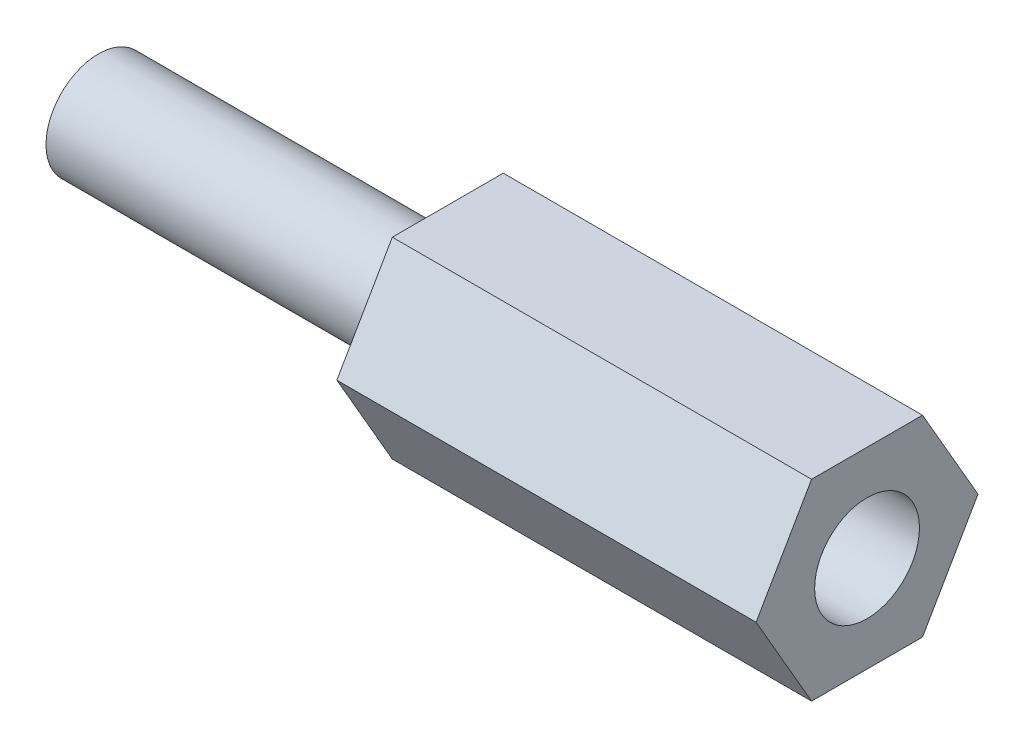
ISO-10303-21;
HEADER;
FILE_DESCRIPTION(('STEP AP214'),'2;1');
FILE_NAME('part.step','',(''),(''),'','','');
FILE_SCHEMA(('AUTOMOTIVE_DESIGN { 1 0 10303 214 1 1 1 1 }'));
ENDSEC;
DATA;
#1=APPLICATION_CONTEXT('core data for automotive mechanical design processes');
#2=APPLICATION_PROTOCOL_DEFINITION('international standard','automotive_design',2000,#1);
#3=PRODUCT_CONTEXT('',#1,'mechanical');
#4=PRODUCT('Part','Part','',(#3));
#5=PRODUCT_RELATED_PRODUCT_CATEGORY('part','',(#4));
#6=PRODUCT_DEFINITION_FORMATION('','',#4);
#7=PRODUCT_DEFINITION_CONTEXT('part definition',#1,'design');
#8=PRODUCT_DEFINITION('design','',#6,#7);
#9=PRODUCT_DEFINITION_SHAPE('','',#8);
#10=(LENGTH_UNIT() NAMED_UNIT(*) SI_UNIT(.MILLI.,.METRE.));
#11=(NAMED_UNIT(*) PLANE_ANGLE_UNIT() SI_UNIT($,.RADIAN.));
#12=(NAMED_UNIT(*) SI_UNIT($,.STERADIAN.) SOLID_ANGLE_UNIT());
#13=UNCERTAINTY_MEASURE_WITH_UNIT(LENGTH_MEASURE(1.E-05),#10,'distance_accuracy_value','');
#14=(GEOMETRIC_REPRESENTATION_CONTEXT(3) GLOBAL_UNCERTAINTY_ASSIGNED_CONTEXT((#13)) GLOBAL_UNIT_ASSIGNED_CONTEXT((#10,
#11,#12)) REPRESENTATION_CONTEXT('',''));
#15=CARTESIAN_POINT('',(0.,0.,0.));
#16=DIRECTION('',(0.,0.,1.));
#17=DIRECTION('',(1.,0.,0.));
#18=AXIS2_PLACEMENT_3D('',#15,#16,#17);
#19=CARTESIAN_POINT('',(12.,0.,0.));
#20=DIRECTION('',(-1.,0.,0.));
#21=DIRECTION('',(0.,0.,1.));
#22=AXIS2_PLACEMENT_3D('',#19,#20,#21);
#23=CYLINDRICAL_SURFACE('',#22,1.5);
#24=CARTESIAN_POINT('',(12.,0.,0.));
#25=DIRECTION('',(1.,0.,0.));
#26=DIRECTION('',(0.,0.,-1.));
#27=AXIS2_PLACEMENT_3D('',#24,#25,#26);
#28=CIRCLE('',#27,1.5);
#29=CARTESIAN_POINT('',(12.,0.,-1.5));
#30=VERTEX_POINT('',#29);
#31=EDGE_CURVE('E122',#30,#30,#28,.T.);
#32=ORIENTED_EDGE('',*,*,#31,.T.);
#33=EDGE_LOOP('',(#32));
#34=FACE_BOUND('',#33,.T.);
#35=CARTESIAN_POINT('',(2.,0.,0.));
#36=DIRECTION('',(-1.,0.,0.));
#37=DIRECTION('',(0.,0.,1.));
#38=AXIS2_PLACEMENT_3D('',#35,#36,#37);
#39=CIRCLE('',#38,1.5);
#40=CARTESIAN_POINT('',(2.,0.,1.5));
#41=VERTEX_POINT('',#40);
#42=EDGE_CURVE('E227',#41,#41,#39,.T.);
#43=ORIENTED_EDGE('',*,*,#42,.T.);
#44=EDGE_LOOP('',(#43));
#45=FACE_BOUND('',#44,.T.);
#46=ADVANCED_FACE('F32',(#34,#45),#23,.F.);
#47=CARTESIAN_POINT('',(12.,0.,0.));
#48=DIRECTION('',(1.,0.,0.));
#49=DIRECTION('',(0.,0.,-1.));
#50=AXIS2_PLACEMENT_3D('',#47,#48,#49);
#51=PLANE('',#50);
#52=DIRECTION('',(0.,0.866025403784439,0.5));
#53=VECTOR('',#52,1.);
#54=CARTESIAN_POINT('',(12.,0.,-3.17542648054295));
#55=LINE('',#54,#53);
#56=CARTESIAN_POINT('',(12.,0.,-3.17542648054295));
#57=VERTEX_POINT('',#56);
#58=CARTESIAN_POINT('',(12.,2.75000000000001,-1.58771324027147));
#59=VERTEX_POINT('',#58);
#60=EDGE_CURVE('E129',#57,#59,#55,.T.);
#61=ORIENTED_EDGE('',*,*,#60,.T.);
#62=DIRECTION('',(0.,0.,1.));
#63=VECTOR('',#62,1.);
#64=CARTESIAN_POINT('',(12.,2.75000000000001,-1.58771324027147));
#65=LINE('',#64,#63);
#66=CARTESIAN_POINT('',(12.,2.75000000000001,1.58771324027147));
#67=VERTEX_POINT('',#66);
#68=EDGE_CURVE('E86',#59,#67,#65,.T.);
#69=ORIENTED_EDGE('',*,*,#68,.T.);
#70=DIRECTION('',(0.,-0.866025403784439,0.5));
#71=VECTOR('',#70,1.);
#72=CARTESIAN_POINT('',(12.,2.75000000000001,1.58771324027147));
#73=LINE('',#72,#71);
#74=CARTESIAN_POINT('',(12.,0.,3.17542648054295));
#75=VERTEX_POINT('',#74);
#76=EDGE_CURVE('E100',#67,#75,#73,.T.);
#77=ORIENTED_EDGE('',*,*,#76,.T.);
#78=DIRECTION('',(0.,-0.866025403784439,-0.5));
#79=VECTOR('',#78,1.);
#80=CARTESIAN_POINT('',(12.,0.,3.17542648054295));
#81=LINE('',#80,#79);
#82=CARTESIAN_POINT('',(12.,-2.75,1.58771324027148));
#83=VERTEX_POINT('',#82);
#84=EDGE_CURVE('E93',#75,#83,#81,.T.);
#85=ORIENTED_EDGE('',*,*,#84,.T.);
#86=DIRECTION('',(0.,0.,-1.));
#87=VECTOR('',#86,1.);
#88=CARTESIAN_POINT('',(12.,-2.75,1.58771324027148));
#89=LINE('',#88,#87);
#90=CARTESIAN_POINT('',(12.,-2.75000000000001,-1.58771324027147));
#91=VERTEX_POINT('',#90);
#92=EDGE_CURVE('E98',#83,#91,#89,.T.);
#93=ORIENTED_EDGE('',*,*,#92,.T.);
#94=DIRECTION('',(0.,0.866025403784438,-0.5));
#95=VECTOR('',#94,1.);
#96=CARTESIAN_POINT('',(12.,-2.75000000000001,-1.58771324027147));
#97=LINE('',#96,#95);
#98=EDGE_CURVE('E49',#91,#57,#97,.T.);
#99=ORIENTED_EDGE('',*,*,#98,.T.);
#100=EDGE_LOOP('',(#61,#69,#77,#85,#93,#99));
#101=FACE_BOUND('',#100,.T.);
#102=ORIENTED_EDGE('',*,*,#31,.F.);
#103=EDGE_LOOP('',(#102));
#104=FACE_BOUND('',#103,.T.);
#105=ADVANCED_FACE('F95',(#101,#104),#51,.T.);
#106=CARTESIAN_POINT('',(0.,0.,0.));
#107=DIRECTION('',(1.,0.,0.));
#108=DIRECTION('',(0.,0.,-1.));
#109=AXIS2_PLACEMENT_3D('',#106,#107,#108);
#110=PLANE('',#109);
#111=DIRECTION('',(0.,0.866025403784439,0.5));
#112=VECTOR('',#111,1.);
#113=CARTESIAN_POINT('',(0.,0.,-3.17542648054295));
#114=LINE('',#113,#112);
#115=CARTESIAN_POINT('',(0.,0.,-3.17542648054295));
#116=VERTEX_POINT('',#115);
#117=CARTESIAN_POINT('',(0.,2.75000000000001,-1.58771324027147));
#118=VERTEX_POINT('',#117);
#119=EDGE_CURVE('E118',#116,#118,#114,.T.);
#120=ORIENTED_EDGE('',*,*,#119,.F.);
#121=DIRECTION('',(0.,0.866025403784438,-0.5));
#122=VECTOR('',#121,1.);
#123=CARTESIAN_POINT('',(0.,-2.75000000000001,-1.58771324027147));
#124=LINE('',#123,#122);
#125=CARTESIAN_POINT('',(0.,-2.75000000000001,-1.58771324027147));
#126=VERTEX_POINT('',#125);
#127=EDGE_CURVE('E78',#126,#116,#124,.T.);
#128=ORIENTED_EDGE('',*,*,#127,.F.);
#129=DIRECTION('',(0.,0.,-1.));
#130=VECTOR('',#129,1.);
#131=CARTESIAN_POINT('',(0.,-2.75,1.58771324027148));
#132=LINE('',#131,#130);
#133=CARTESIAN_POINT('',(0.,-2.75,1.58771324027148));
#134=VERTEX_POINT('',#133);
#135=EDGE_CURVE('E72',#134,#126,#132,.T.);
#136=ORIENTED_EDGE('',*,*,#135,.F.);
#137=DIRECTION('',(0.,-0.866025403784439,-0.5));
#138=VECTOR('',#137,1.);
#139=CARTESIAN_POINT('',(0.,0.,3.17542648054295));
#140=LINE('',#139,#138);
#141=CARTESIAN_POINT('',(0.,0.,3.17542648054295));
#142=VERTEX_POINT('',#141);
#143=EDGE_CURVE('E108',#142,#134,#140,.T.);
#144=ORIENTED_EDGE('',*,*,#143,.F.);
#145=DIRECTION('',(0.,-0.866025403784439,0.5));
#146=VECTOR('',#145,1.);
#147=CARTESIAN_POINT('',(0.,2.75000000000001,1.58771324027147));
#148=LINE('',#147,#146);
#149=CARTESIAN_POINT('',(0.,2.75000000000001,1.58771324027147));
#150=VERTEX_POINT('',#149);
#151=EDGE_CURVE('E124',#150,#142,#148,.T.);
#152=ORIENTED_EDGE('',*,*,#151,.F.);
#153=DIRECTION('',(0.,0.,1.));
#154=VECTOR('',#153,1.);
#155=CARTESIAN_POINT('',(0.,2.75000000000001,-1.58771324027147));
#156=LINE('',#155,#154);
#157=EDGE_CURVE('E121',#118,#150,#156,.T.);
#158=ORIENTED_EDGE('',*,*,#157,.F.);
#159=EDGE_LOOP('',(#120,#128,#136,#144,#152,#158));
#160=FACE_BOUND('',#159,.T.);
#161=CARTESIAN_POINT('',(0.,0.,0.));
#162=DIRECTION('',(1.,0.,0.));
#163=DIRECTION('',(0.,0.,-1.));
#164=AXIS2_PLACEMENT_3D('',#161,#162,#163);
#165=CIRCLE('',#164,1.5);
#166=CARTESIAN_POINT('',(0.,0.,-1.5));
#167=VERTEX_POINT('',#166);
#168=EDGE_CURVE('E230',#167,#167,#165,.T.);
#169=ORIENTED_EDGE('',*,*,#168,.T.);
#170=EDGE_LOOP('',(#169));
#171=FACE_BOUND('',#170,.T.);
#172=ADVANCED_FACE('F138',(#160,#171),#110,.F.);
#173=CARTESIAN_POINT('',(12.,0.,-3.17542648054295));
#174=DIRECTION('',(0.,-0.5,0.866025403784439));
#175=DIRECTION('',(0.,-0.866025403784439,-0.5));
#176=AXIS2_PLACEMENT_3D('',#173,#174,#175);
#177=PLANE('',#176);
#178=ORIENTED_EDGE('',*,*,#119,.T.);
#179=DIRECTION('',(-1.,0.,0.));
#180=VECTOR('',#179,1.);
#181=CARTESIAN_POINT('',(12.,2.75000000000001,-1.58771324027147));
#182=LINE('',#181,#180);
#183=EDGE_CURVE('E11',#59,#118,#182,.T.);
#184=ORIENTED_EDGE('',*,*,#183,.F.);
#185=ORIENTED_EDGE('',*,*,#60,.F.);
#186=DIRECTION('',(-1.,0.,0.));
#187=VECTOR('',#186,1.);
#188=CARTESIAN_POINT('',(12.,0.,-3.17542648054295));
#189=LINE('',#188,#187);
#190=EDGE_CURVE('E114',#57,#116,#189,.T.);
#191=ORIENTED_EDGE('',*,*,#190,.T.);
#192=EDGE_LOOP('',(#178,#184,#185,#191));
#193=FACE_BOUND('',#192,.T.);
#194=ADVANCED_FACE('F34',(#193),#177,.F.);
#195=CARTESIAN_POINT('',(12.,2.75000000000001,-1.58771324027147));
#196=DIRECTION('',(0.,-1.,0.));
#197=DIRECTION('',(0.,0.,-1.));
#198=AXIS2_PLACEMENT_3D('',#195,#196,#197);
#199=PLANE('',#198);
#200=ORIENTED_EDGE('',*,*,#157,.T.);
#201=DIRECTION('',(-1.,0.,0.));
#202=VECTOR('',#201,1.);
#203=CARTESIAN_POINT('',(12.,2.75000000000001,1.58771324027147));
#204=LINE('',#203,#202);
#205=EDGE_CURVE('E41',#67,#150,#204,.T.);
#206=ORIENTED_EDGE('',*,*,#205,.F.);
#207=ORIENTED_EDGE('',*,*,#68,.F.);
#208=ORIENTED_EDGE('',*,*,#183,.T.);
#209=EDGE_LOOP('',(#200,#206,#207,#208));
#210=FACE_BOUND('',#209,.T.);
#211=ADVANCED_FACE('F170',(#210),#199,.F.);
#212=CARTESIAN_POINT('',(12.,2.75000000000001,1.58771324027147));
#213=DIRECTION('',(0.,-0.5,-0.866025403784438));
#214=DIRECTION('',(0.,0.866025403784439,-0.5));
#215=AXIS2_PLACEMENT_3D('',#212,#213,#214);
#216=PLANE('',#215);
#217=ORIENTED_EDGE('',*,*,#151,.T.);
#218=DIRECTION('',(-1.,0.,0.));
#219=VECTOR('',#218,1.);
#220=CARTESIAN_POINT('',(12.,0.,3.17542648054295));
#221=LINE('',#220,#219);
#222=EDGE_CURVE('E109',#75,#142,#221,.T.);
#223=ORIENTED_EDGE('',*,*,#222,.F.);
#224=ORIENTED_EDGE('',*,*,#76,.F.);
#225=ORIENTED_EDGE('',*,*,#205,.T.);
#226=EDGE_LOOP('',(#217,#223,#224,#225));
#227=FACE_BOUND('',#226,.T.);
#228=ADVANCED_FACE('F135',(#227),#216,.F.);
#229=CARTESIAN_POINT('',(12.,0.,3.17542648054295));
#230=DIRECTION('',(0.,0.5,-0.866025403784439));
#231=DIRECTION('',(0.,0.866025403784439,0.5));
#232=AXIS2_PLACEMENT_3D('',#229,#230,#231);
#233=PLANE('',#232);
#234=ORIENTED_EDGE('',*,*,#143,.T.);
#235=DIRECTION('',(-1.,0.,0.));
#236=VECTOR('',#235,1.);
#237=CARTESIAN_POINT('',(12.,-2.75,1.58771324027148));
#238=LINE('',#237,#236);
#239=EDGE_CURVE('E105',#83,#134,#238,.T.);
#240=ORIENTED_EDGE('',*,*,#239,.F.);
#241=ORIENTED_EDGE('',*,*,#84,.F.);
#242=ORIENTED_EDGE('',*,*,#222,.T.);
#243=EDGE_LOOP('',(#234,#240,#241,#242));
#244=FACE_BOUND('',#243,.T.);
#245=ADVANCED_FACE('F106',(#244),#233,.F.);
#246=CARTESIAN_POINT('',(12.,-2.75,1.58771324027148));
#247=DIRECTION('',(0.,1.,0.));
#248=DIRECTION('',(0.,0.,1.));
#249=AXIS2_PLACEMENT_3D('',#246,#247,#248);
#250=PLANE('',#249);
#251=ORIENTED_EDGE('',*,*,#135,.T.);
#252=DIRECTION('',(-1.,0.,0.));
#253=VECTOR('',#252,1.);
#254=CARTESIAN_POINT('',(12.,-2.75000000000001,-1.58771324027147));
#255=LINE('',#254,#253);
#256=EDGE_CURVE('E110',#91,#126,#255,.T.);
#257=ORIENTED_EDGE('',*,*,#256,.F.);
#258=ORIENTED_EDGE('',*,*,#92,.F.);
#259=ORIENTED_EDGE('',*,*,#239,.T.);
#260=EDGE_LOOP('',(#251,#257,#258,#259));
#261=FACE_BOUND('',#260,.T.);
#262=ADVANCED_FACE('F112',(#261),#250,.F.);
#263=CARTESIAN_POINT('',(12.,-2.75000000000001,-1.58771324027147));
#264=DIRECTION('',(0.,0.5,0.866025403784438));
#265=DIRECTION('',(0.,-0.866025403784438,0.5));
#266=AXIS2_PLACEMENT_3D('',#263,#264,#265);
#267=PLANE('',#266);
#268=ORIENTED_EDGE('',*,*,#127,.T.);
#269=ORIENTED_EDGE('',*,*,#190,.F.);
#270=ORIENTED_EDGE('',*,*,#98,.F.);
#271=ORIENTED_EDGE('',*,*,#256,.T.);
#272=EDGE_LOOP('',(#268,#269,#270,#271));
#273=FACE_BOUND('',#272,.T.);
#274=ADVANCED_FACE('F143',(#273),#267,.F.);
#275=CARTESIAN_POINT('',(2.,0.,0.));
#276=DIRECTION('',(-1.,0.,0.));
#277=DIRECTION('',(0.,0.,1.));
#278=AXIS2_PLACEMENT_3D('',#275,#276,#277);
#279=PLANE('',#278);
#280=ORIENTED_EDGE('',*,*,#42,.F.);
#281=EDGE_LOOP('',(#280));
#282=FACE_BOUND('',#281,.T.);
#283=ADVANCED_FACE('F145',(#282),#279,.F.);
#284=CARTESIAN_POINT('',(2.,0.,0.));
#285=DIRECTION('',(-1.,0.,0.));
#286=DIRECTION('',(0.,0.,1.));
#287=AXIS2_PLACEMENT_3D('',#284,#285,#286);
#288=CYLINDRICAL_SURFACE('',#287,1.5);
#289=CARTESIAN_POINT('',(-10.,0.,0.));
#290=DIRECTION('',(-1.,0.,0.));
#291=DIRECTION('',(0.,0.,1.));
#292=AXIS2_PLACEMENT_3D('',#289,#290,#291);
#293=CIRCLE('',#292,1.5);
#294=CARTESIAN_POINT('',(-10.,0.,1.5));
#295=VERTEX_POINT('',#294);
#296=EDGE_CURVE('E226',#295,#295,#293,.T.);
#297=ORIENTED_EDGE('',*,*,#296,.F.);
#298=EDGE_LOOP('',(#297));
#299=FACE_BOUND('',#298,.T.);
#300=ORIENTED_EDGE('',*,*,#168,.F.);
#301=EDGE_LOOP('',(#300));
#302=FACE_BOUND('',#301,.T.);
#303=ADVANCED_FACE('F151',(#299,#302),#288,.T.);
#304=CARTESIAN_POINT('',(-10.,0.,0.));
#305=DIRECTION('',(-1.,0.,0.));
#306=DIRECTION('',(0.,0.,1.));
#307=AXIS2_PLACEMENT_3D('',#304,#305,#306);
#308=PLANE('',#307);
#309=ORIENTED_EDGE('',*,*,#296,.T.);
#310=EDGE_LOOP('',(#309));
#311=FACE_BOUND('',#310,.T.);
#312=ADVANCED_FACE('F211',(#311),#308,.T.);
#313=CLOSED_SHELL('',(#46,#105,#172,#194,#211,#228,#245,#262,#274,#283,#303,#312));
#314=MANIFOLD_SOLID_BREP('B2',#313);
#315=ADVANCED_BREP_SHAPE_REPRESENTATION('',(#18,#314),#14);
#316=SHAPE_DEFINITION_REPRESENTATION(#9,#315);
ENDSEC;
END-ISO-10303-21;
